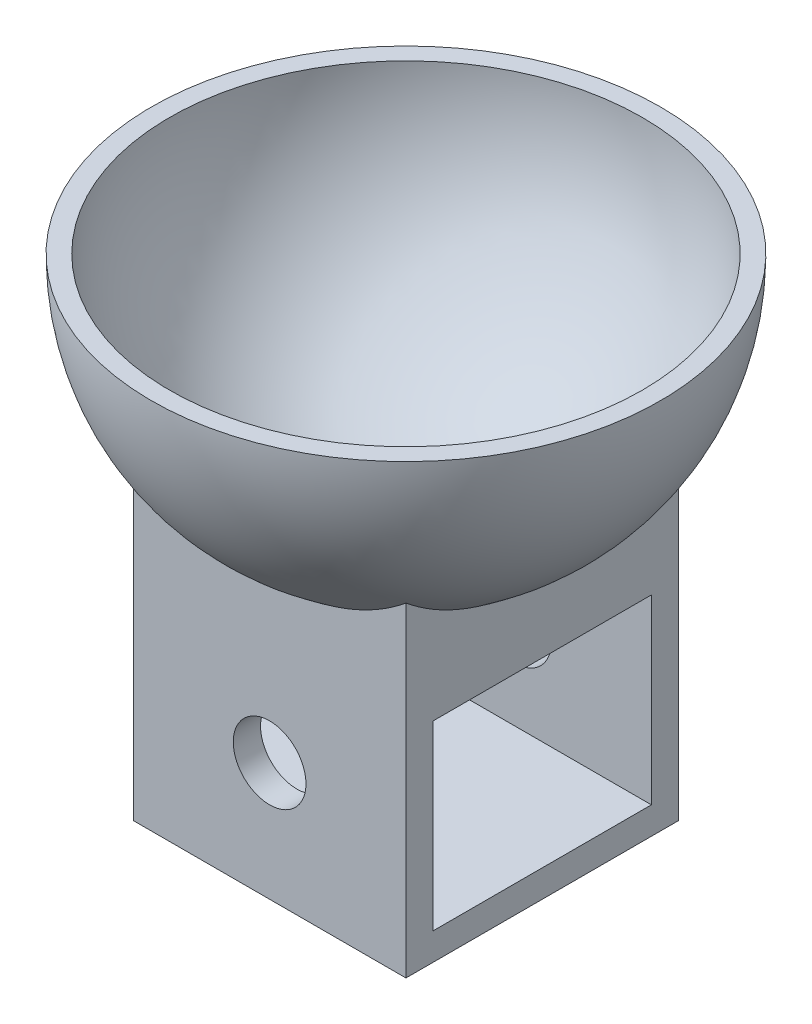
ISO-10303-21;
HEADER;
FILE_DESCRIPTION(('STEP AP214'),'2;1');
FILE_NAME('part.step','',(''),(''),'','','');
FILE_SCHEMA(('AUTOMOTIVE_DESIGN { 1 0 10303 214 1 1 1 1 }'));
ENDSEC;
DATA;
#1=APPLICATION_CONTEXT('core data for automotive mechanical design processes');
#2=APPLICATION_PROTOCOL_DEFINITION('international standard','automotive_design',2000,#1);
#3=PRODUCT_CONTEXT('',#1,'mechanical');
#4=PRODUCT('Part','Part','',(#3));
#5=PRODUCT_RELATED_PRODUCT_CATEGORY('part','',(#4));
#6=PRODUCT_DEFINITION_FORMATION('','',#4);
#7=PRODUCT_DEFINITION_CONTEXT('part definition',#1,'design');
#8=PRODUCT_DEFINITION('design','',#6,#7);
#9=PRODUCT_DEFINITION_SHAPE('','',#8);
#10=(LENGTH_UNIT() NAMED_UNIT(*) SI_UNIT(.MILLI.,.METRE.));
#11=(NAMED_UNIT(*) PLANE_ANGLE_UNIT() SI_UNIT($,.RADIAN.));
#12=(NAMED_UNIT(*) SI_UNIT($,.STERADIAN.) SOLID_ANGLE_UNIT());
#13=UNCERTAINTY_MEASURE_WITH_UNIT(LENGTH_MEASURE(1.E-05),#10,'distance_accuracy_value','');
#14=(GEOMETRIC_REPRESENTATION_CONTEXT(3) GLOBAL_UNCERTAINTY_ASSIGNED_CONTEXT((#13)) GLOBAL_UNIT_ASSIGNED_CONTEXT((#10,
#11,#12)) REPRESENTATION_CONTEXT('',''));
#15=CARTESIAN_POINT('',(0.,0.,0.));
#16=DIRECTION('',(0.,0.,1.));
#17=DIRECTION('',(1.,0.,0.));
#18=AXIS2_PLACEMENT_3D('',#15,#16,#17);
#19=CARTESIAN_POINT('',(15.,26.,15.));
#20=DIRECTION('',(-1.,0.,0.));
#21=DIRECTION('',(0.,0.,1.));
#22=AXIS2_PLACEMENT_3D('',#19,#20,#21);
#23=PLANE('',#22);
#24=DIRECTION('',(0.,0.,-1.));
#25=VECTOR('',#24,1.);
#26=CARTESIAN_POINT('',(15.,0.,15.));
#27=LINE('',#26,#25);
#28=CARTESIAN_POINT('',(15.,0.,15.));
#29=VERTEX_POINT('',#28);
#30=CARTESIAN_POINT('',(15.,0.,-15.));
#31=VERTEX_POINT('',#30);
#32=EDGE_CURVE('E159',#29,#31,#27,.T.);
#33=ORIENTED_EDGE('',*,*,#32,.T.);
#34=DIRECTION('',(0.,-1.,0.));
#35=VECTOR('',#34,1.);
#36=CARTESIAN_POINT('',(15.,26.,-15.));
#37=LINE('',#36,#35);
#38=CARTESIAN_POINT('',(15.,35.7243331175029,-15.));
#39=VERTEX_POINT('',#38);
#40=EDGE_CURVE('E11',#39,#31,#37,.T.);
#41=ORIENTED_EDGE('',*,*,#40,.F.);
#42=CARTESIAN_POINT('',(15.,54.,0.));
#43=DIRECTION('',(-1.,0.,0.));
#44=DIRECTION('',(0.,0.,1.));
#45=AXIS2_PLACEMENT_3D('',#42,#43,#44);
#46=CIRCLE('',#45,23.6431808350738);
#47=CARTESIAN_POINT('',(15.,35.7243331175029,15.));
#48=VERTEX_POINT('',#47);
#49=EDGE_CURVE('E98',#48,#39,#46,.F.);
#50=ORIENTED_EDGE('',*,*,#49,.F.);
#51=DIRECTION('',(0.,-1.,0.));
#52=VECTOR('',#51,1.);
#53=CARTESIAN_POINT('',(15.,26.,15.));
#54=LINE('',#53,#52);
#55=EDGE_CURVE('E102',#48,#29,#54,.T.);
#56=ORIENTED_EDGE('',*,*,#55,.T.);
#57=EDGE_LOOP('',(#33,#41,#50,#56));
#58=FACE_BOUND('',#57,.T.);
#59=DIRECTION('',(0.,0.,-1.));
#60=VECTOR('',#59,1.);
#61=CARTESIAN_POINT('',(15.,3.,0.));
#62=LINE('',#61,#60);
#63=CARTESIAN_POINT('',(15.,3.,12.));
#64=VERTEX_POINT('',#63);
#65=CARTESIAN_POINT('',(15.,3.,-12.));
#66=VERTEX_POINT('',#65);
#67=EDGE_CURVE('E137',#64,#66,#62,.T.);
#68=ORIENTED_EDGE('',*,*,#67,.F.);
#69=DIRECTION('',(0.,-1.,0.));
#70=VECTOR('',#69,1.);
#71=CARTESIAN_POINT('',(15.,26.,12.));
#72=LINE('',#71,#70);
#73=CARTESIAN_POINT('',(15.,23.,12.));
#74=VERTEX_POINT('',#73);
#75=EDGE_CURVE('E145',#74,#64,#72,.T.);
#76=ORIENTED_EDGE('',*,*,#75,.F.);
#77=DIRECTION('',(0.,0.,-1.));
#78=VECTOR('',#77,1.);
#79=CARTESIAN_POINT('',(15.,23.,0.));
#80=LINE('',#79,#78);
#81=CARTESIAN_POINT('',(15.,23.,-12.));
#82=VERTEX_POINT('',#81);
#83=EDGE_CURVE('E48',#74,#82,#80,.T.);
#84=ORIENTED_EDGE('',*,*,#83,.T.);
#85=DIRECTION('',(0.,-1.,0.));
#86=VECTOR('',#85,1.);
#87=CARTESIAN_POINT('',(15.,26.,-12.));
#88=LINE('',#87,#86);
#89=EDGE_CURVE('E151',#82,#66,#88,.T.);
#90=ORIENTED_EDGE('',*,*,#89,.T.);
#91=EDGE_LOOP('',(#68,#76,#84,#90));
#92=FACE_BOUND('',#91,.T.);
#93=ADVANCED_FACE('F33',(#58,#92),#23,.F.);
#94=CARTESIAN_POINT('',(-15.,26.,15.));
#95=DIRECTION('',(1.,0.,0.));
#96=DIRECTION('',(0.,0.,-1.));
#97=AXIS2_PLACEMENT_3D('',#94,#95,#96);
#98=PLANE('',#97);
#99=DIRECTION('',(0.,0.,1.));
#100=VECTOR('',#99,1.);
#101=CARTESIAN_POINT('',(-15.,0.,15.));
#102=LINE('',#101,#100);
#103=CARTESIAN_POINT('',(-15.,0.,-15.));
#104=VERTEX_POINT('',#103);
#105=CARTESIAN_POINT('',(-15.,0.,15.));
#106=VERTEX_POINT('',#105);
#107=EDGE_CURVE('E168',#104,#106,#102,.T.);
#108=ORIENTED_EDGE('',*,*,#107,.T.);
#109=DIRECTION('',(0.,-1.,0.));
#110=VECTOR('',#109,1.);
#111=CARTESIAN_POINT('',(-15.,26.,15.));
#112=LINE('',#111,#110);
#113=CARTESIAN_POINT('',(-15.,35.7243331175029,15.));
#114=VERTEX_POINT('',#113);
#115=EDGE_CURVE('E118',#114,#106,#112,.T.);
#116=ORIENTED_EDGE('',*,*,#115,.F.);
#117=CARTESIAN_POINT('',(-15.,54.,0.));
#118=DIRECTION('',(1.,0.,0.));
#119=DIRECTION('',(0.,0.,-1.));
#120=AXIS2_PLACEMENT_3D('',#117,#118,#119);
#121=CIRCLE('',#120,23.6431808350738);
#122=CARTESIAN_POINT('',(-15.,35.7243331175029,-15.));
#123=VERTEX_POINT('',#122);
#124=EDGE_CURVE('E122',#123,#114,#121,.F.);
#125=ORIENTED_EDGE('',*,*,#124,.F.);
#126=DIRECTION('',(0.,-1.,0.));
#127=VECTOR('',#126,1.);
#128=CARTESIAN_POINT('',(-15.,26.,-15.));
#129=LINE('',#128,#127);
#130=EDGE_CURVE('E41',#123,#104,#129,.T.);
#131=ORIENTED_EDGE('',*,*,#130,.T.);
#132=EDGE_LOOP('',(#108,#116,#125,#131));
#133=FACE_BOUND('',#132,.T.);
#134=DIRECTION('',(0.,0.,1.));
#135=VECTOR('',#134,1.);
#136=CARTESIAN_POINT('',(-15.,3.,0.));
#137=LINE('',#136,#135);
#138=CARTESIAN_POINT('',(-15.,3.,-12.));
#139=VERTEX_POINT('',#138);
#140=CARTESIAN_POINT('',(-15.,3.,12.));
#141=VERTEX_POINT('',#140);
#142=EDGE_CURVE('E140',#139,#141,#137,.T.);
#143=ORIENTED_EDGE('',*,*,#142,.F.);
#144=DIRECTION('',(0.,-1.,0.));
#145=VECTOR('',#144,1.);
#146=CARTESIAN_POINT('',(-15.,26.,-12.));
#147=LINE('',#146,#145);
#148=CARTESIAN_POINT('',(-15.,23.,-12.));
#149=VERTEX_POINT('',#148);
#150=EDGE_CURVE('E148',#149,#139,#147,.T.);
#151=ORIENTED_EDGE('',*,*,#150,.F.);
#152=DIRECTION('',(0.,0.,1.));
#153=VECTOR('',#152,1.);
#154=CARTESIAN_POINT('',(-15.,23.,0.));
#155=LINE('',#154,#153);
#156=CARTESIAN_POINT('',(-15.,23.,12.));
#157=VERTEX_POINT('',#156);
#158=EDGE_CURVE('E53',#149,#157,#155,.T.);
#159=ORIENTED_EDGE('',*,*,#158,.T.);
#160=DIRECTION('',(0.,-1.,0.));
#161=VECTOR('',#160,1.);
#162=CARTESIAN_POINT('',(-15.,26.,12.));
#163=LINE('',#162,#161);
#164=EDGE_CURVE('E152',#157,#141,#163,.T.);
#165=ORIENTED_EDGE('',*,*,#164,.T.);
#166=EDGE_LOOP('',(#143,#151,#159,#165));
#167=FACE_BOUND('',#166,.T.);
#168=ADVANCED_FACE('F175',(#133,#167),#98,.F.);
#169=CARTESIAN_POINT('',(-15.,26.,-15.));
#170=DIRECTION('',(0.,0.,1.));
#171=DIRECTION('',(1.,0.,0.));
#172=AXIS2_PLACEMENT_3D('',#169,#170,#171);
#173=PLANE('',#172);
#174=CARTESIAN_POINT('',(0.,13.,-15.));
#175=DIRECTION('',(0.,0.,1.));
#176=DIRECTION('',(1.,0.,0.));
#177=AXIS2_PLACEMENT_3D('',#174,#175,#176);
#178=CIRCLE('',#177,4.);
#179=CARTESIAN_POINT('',(4.,13.,-15.));
#180=VERTEX_POINT('',#179);
#181=EDGE_CURVE('E128',#180,#180,#178,.T.);
#182=ORIENTED_EDGE('',*,*,#181,.T.);
#183=EDGE_LOOP('',(#182));
#184=FACE_BOUND('',#183,.T.);
#185=DIRECTION('',(-1.,0.,0.));
#186=VECTOR('',#185,1.);
#187=CARTESIAN_POINT('',(-15.,0.,-15.));
#188=LINE('',#187,#186);
#189=EDGE_CURVE('E166',#31,#104,#188,.T.);
#190=ORIENTED_EDGE('',*,*,#189,.T.);
#191=ORIENTED_EDGE('',*,*,#130,.F.);
#192=CARTESIAN_POINT('',(0.,54.,-15.));
#193=DIRECTION('',(0.,0.,1.));
#194=DIRECTION('',(1.,0.,0.));
#195=AXIS2_PLACEMENT_3D('',#192,#193,#194);
#196=CIRCLE('',#195,23.6431808350738);
#197=EDGE_CURVE('E124',#39,#123,#196,.F.);
#198=ORIENTED_EDGE('',*,*,#197,.F.);
#199=ORIENTED_EDGE('',*,*,#40,.T.);
#200=EDGE_LOOP('',(#190,#191,#198,#199));
#201=FACE_BOUND('',#200,.T.);
#202=ADVANCED_FACE('F180',(#184,#201),#173,.F.);
#203=CARTESIAN_POINT('',(-15.,26.,15.));
#204=DIRECTION('',(0.,0.,-1.));
#205=DIRECTION('',(-1.,0.,0.));
#206=AXIS2_PLACEMENT_3D('',#203,#204,#205);
#207=PLANE('',#206);
#208=CARTESIAN_POINT('',(0.,13.,15.));
#209=DIRECTION('',(0.,0.,1.));
#210=DIRECTION('',(1.,0.,0.));
#211=AXIS2_PLACEMENT_3D('',#208,#209,#210);
#212=CIRCLE('',#211,4.);
#213=CARTESIAN_POINT('',(4.,13.,15.));
#214=VERTEX_POINT('',#213);
#215=EDGE_CURVE('E131',#214,#214,#212,.T.);
#216=ORIENTED_EDGE('',*,*,#215,.F.);
#217=EDGE_LOOP('',(#216));
#218=FACE_BOUND('',#217,.T.);
#219=DIRECTION('',(1.,0.,0.));
#220=VECTOR('',#219,1.);
#221=CARTESIAN_POINT('',(-15.,0.,15.));
#222=LINE('',#221,#220);
#223=EDGE_CURVE('E117',#106,#29,#222,.T.);
#224=ORIENTED_EDGE('',*,*,#223,.T.);
#225=ORIENTED_EDGE('',*,*,#55,.F.);
#226=CARTESIAN_POINT('',(0.,54.,15.));
#227=DIRECTION('',(0.,0.,-1.));
#228=DIRECTION('',(-1.,0.,0.));
#229=AXIS2_PLACEMENT_3D('',#226,#227,#228);
#230=CIRCLE('',#229,23.6431808350738);
#231=EDGE_CURVE('E108',#114,#48,#230,.F.);
#232=ORIENTED_EDGE('',*,*,#231,.F.);
#233=ORIENTED_EDGE('',*,*,#115,.T.);
#234=EDGE_LOOP('',(#224,#225,#232,#233));
#235=FACE_BOUND('',#234,.T.);
#236=ADVANCED_FACE('F113',(#218,#235),#207,.F.);
#237=CARTESIAN_POINT('',(0.,0.,0.));
#238=DIRECTION('',(0.,-1.,0.));
#239=DIRECTION('',(0.,0.,-1.));
#240=AXIS2_PLACEMENT_3D('',#237,#238,#239);
#241=PLANE('',#240);
#242=ORIENTED_EDGE('',*,*,#32,.F.);
#243=ORIENTED_EDGE('',*,*,#223,.F.);
#244=ORIENTED_EDGE('',*,*,#107,.F.);
#245=ORIENTED_EDGE('',*,*,#189,.F.);
#246=EDGE_LOOP('',(#242,#243,#244,#245));
#247=FACE_BOUND('',#246,.T.);
#248=ADVANCED_FACE('F179',(#247),#241,.T.);
#249=CARTESIAN_POINT('',(-15.,26.,-12.));
#250=DIRECTION('',(0.,0.,1.));
#251=DIRECTION('',(1.,0.,0.));
#252=AXIS2_PLACEMENT_3D('',#249,#250,#251);
#253=PLANE('',#252);
#254=CARTESIAN_POINT('',(0.,13.,-12.));
#255=DIRECTION('',(0.,0.,1.));
#256=DIRECTION('',(1.,0.,0.));
#257=AXIS2_PLACEMENT_3D('',#254,#255,#256);
#258=CIRCLE('',#257,4.);
#259=CARTESIAN_POINT('',(4.,13.,-12.));
#260=VERTEX_POINT('',#259);
#261=EDGE_CURVE('E134',#260,#260,#258,.T.);
#262=ORIENTED_EDGE('',*,*,#261,.F.);
#263=EDGE_LOOP('',(#262));
#264=FACE_BOUND('',#263,.T.);
#265=DIRECTION('',(-1.,0.,0.));
#266=VECTOR('',#265,1.);
#267=CARTESIAN_POINT('',(0.,3.,-12.));
#268=LINE('',#267,#266);
#269=EDGE_CURVE('E138',#66,#139,#268,.T.);
#270=ORIENTED_EDGE('',*,*,#269,.F.);
#271=ORIENTED_EDGE('',*,*,#89,.F.);
#272=DIRECTION('',(-1.,0.,0.));
#273=VECTOR('',#272,1.);
#274=CARTESIAN_POINT('',(0.,23.,-12.));
#275=LINE('',#274,#273);
#276=EDGE_CURVE('E141',#82,#149,#275,.T.);
#277=ORIENTED_EDGE('',*,*,#276,.T.);
#278=ORIENTED_EDGE('',*,*,#150,.T.);
#279=EDGE_LOOP('',(#270,#271,#277,#278));
#280=FACE_BOUND('',#279,.T.);
#281=ADVANCED_FACE('F213',(#264,#280),#253,.T.);
#282=CARTESIAN_POINT('',(-15.,26.,12.));
#283=DIRECTION('',(0.,0.,-1.));
#284=DIRECTION('',(-1.,0.,0.));
#285=AXIS2_PLACEMENT_3D('',#282,#283,#284);
#286=PLANE('',#285);
#287=CARTESIAN_POINT('',(0.,13.,12.));
#288=DIRECTION('',(0.,0.,-1.));
#289=DIRECTION('',(-1.,0.,0.));
#290=AXIS2_PLACEMENT_3D('',#287,#288,#289);
#291=CIRCLE('',#290,4.);
#292=CARTESIAN_POINT('',(-4.,13.,12.));
#293=VERTEX_POINT('',#292);
#294=EDGE_CURVE('E36',#293,#293,#291,.T.);
#295=ORIENTED_EDGE('',*,*,#294,.F.);
#296=EDGE_LOOP('',(#295));
#297=FACE_BOUND('',#296,.T.);
#298=DIRECTION('',(1.,0.,0.));
#299=VECTOR('',#298,1.);
#300=CARTESIAN_POINT('',(0.,3.,12.));
#301=LINE('',#300,#299);
#302=EDGE_CURVE('E146',#141,#64,#301,.T.);
#303=ORIENTED_EDGE('',*,*,#302,.F.);
#304=ORIENTED_EDGE('',*,*,#164,.F.);
#305=DIRECTION('',(1.,0.,0.));
#306=VECTOR('',#305,1.);
#307=CARTESIAN_POINT('',(0.,23.,12.));
#308=LINE('',#307,#306);
#309=EDGE_CURVE('E143',#157,#74,#308,.T.);
#310=ORIENTED_EDGE('',*,*,#309,.T.);
#311=ORIENTED_EDGE('',*,*,#75,.T.);
#312=EDGE_LOOP('',(#303,#304,#310,#311));
#313=FACE_BOUND('',#312,.T.);
#314=ADVANCED_FACE('F222',(#297,#313),#286,.T.);
#315=CARTESIAN_POINT('',(0.,23.,0.));
#316=DIRECTION('',(0.,-1.,0.));
#317=DIRECTION('',(0.,0.,-1.));
#318=AXIS2_PLACEMENT_3D('',#315,#316,#317);
#319=PLANE('',#318);
#320=ORIENTED_EDGE('',*,*,#83,.F.);
#321=ORIENTED_EDGE('',*,*,#309,.F.);
#322=ORIENTED_EDGE('',*,*,#158,.F.);
#323=ORIENTED_EDGE('',*,*,#276,.F.);
#324=EDGE_LOOP('',(#320,#321,#322,#323));
#325=FACE_BOUND('',#324,.T.);
#326=ADVANCED_FACE('F218',(#325),#319,.T.);
#327=CARTESIAN_POINT('',(0.,3.,0.));
#328=DIRECTION('',(0.,-1.,0.));
#329=DIRECTION('',(0.,0.,-1.));
#330=AXIS2_PLACEMENT_3D('',#327,#328,#329);
#331=PLANE('',#330);
#332=ORIENTED_EDGE('',*,*,#67,.T.);
#333=ORIENTED_EDGE('',*,*,#269,.T.);
#334=ORIENTED_EDGE('',*,*,#142,.T.);
#335=ORIENTED_EDGE('',*,*,#302,.T.);
#336=EDGE_LOOP('',(#332,#333,#334,#335));
#337=FACE_BOUND('',#336,.T.);
#338=ADVANCED_FACE('F214',(#337),#331,.F.);
#339=CARTESIAN_POINT('',(0.,13.,-15.));
#340=DIRECTION('',(0.,0.,1.));
#341=DIRECTION('',(1.,0.,0.));
#342=AXIS2_PLACEMENT_3D('',#339,#340,#341);
#343=CYLINDRICAL_SURFACE('',#342,4.);
#344=ORIENTED_EDGE('',*,*,#294,.T.);
#345=EDGE_LOOP('',(#344));
#346=FACE_BOUND('',#345,.T.);
#347=ORIENTED_EDGE('',*,*,#215,.T.);
#348=EDGE_LOOP('',(#347));
#349=FACE_BOUND('',#348,.T.);
#350=ADVANCED_FACE('F217',(#346,#349),#343,.F.);
#351=ORIENTED_EDGE('',*,*,#261,.T.);
#352=EDGE_LOOP('',(#351));
#353=FACE_BOUND('',#352,.T.);
#354=ORIENTED_EDGE('',*,*,#181,.F.);
#355=EDGE_LOOP('',(#354));
#356=FACE_BOUND('',#355,.T.);
#357=ADVANCED_FACE('F231',(#353,#356),#343,.F.);
#358=CARTESIAN_POINT('',(0.,54.,0.));
#359=DIRECTION('',(0.,-1.,0.));
#360=DIRECTION('',(-1.,0.,0.));
#361=AXIS2_PLACEMENT_3D('',#358,#359,#360);
#362=SPHERICAL_SURFACE('',#361,28.);
#363=CARTESIAN_POINT('',(0.,54.,0.));
#364=DIRECTION('',(0.,-1.,0.));
#365=DIRECTION('',(0.,0.,-1.));
#366=AXIS2_PLACEMENT_3D('',#363,#364,#365);
#367=CIRCLE('',#366,28.);
#368=CARTESIAN_POINT('',(0.,54.,-28.));
#369=VERTEX_POINT('',#368);
#370=EDGE_CURVE('E109',#369,#369,#367,.T.);
#371=ORIENTED_EDGE('',*,*,#370,.T.);
#372=EDGE_LOOP('',(#371));
#373=FACE_BOUND('',#372,.T.);
#374=ORIENTED_EDGE('',*,*,#49,.T.);
#375=ORIENTED_EDGE('',*,*,#197,.T.);
#376=ORIENTED_EDGE('',*,*,#124,.T.);
#377=ORIENTED_EDGE('',*,*,#231,.T.);
#378=EDGE_LOOP('',(#374,#375,#376,#377));
#379=FACE_BOUND('',#378,.T.);
#380=ADVANCED_FACE('F120',(#373,#379),#362,.T.);
#381=CARTESIAN_POINT('',(-28.,54.,0.));
#382=DIRECTION('',(0.,-1.,0.));
#383=DIRECTION('',(0.,0.,-1.));
#384=AXIS2_PLACEMENT_3D('',#381,#382,#383);
#385=PLANE('',#384);
#386=ORIENTED_EDGE('',*,*,#370,.F.);
#387=EDGE_LOOP('',(#386));
#388=FACE_BOUND('',#387,.T.);
#389=CARTESIAN_POINT('',(0.,54.,0.));
#390=DIRECTION('',(0.,-1.,0.));
#391=DIRECTION('',(0.,0.,-1.));
#392=AXIS2_PLACEMENT_3D('',#389,#390,#391);
#393=CIRCLE('',#392,26.);
#394=CARTESIAN_POINT('',(0.,54.,-26.));
#395=VERTEX_POINT('',#394);
#396=EDGE_CURVE('E184',#395,#395,#393,.T.);
#397=ORIENTED_EDGE('',*,*,#396,.T.);
#398=EDGE_LOOP('',(#397));
#399=FACE_BOUND('',#398,.T.);
#400=ADVANCED_FACE('F188',(#388,#399),#385,.F.);
#401=CARTESIAN_POINT('',(0.,54.,0.));
#402=DIRECTION('',(0.,-1.,0.));
#403=DIRECTION('',(1.,0.,0.));
#404=AXIS2_PLACEMENT_3D('',#401,#402,#403);
#405=SPHERICAL_SURFACE('',#404,26.);
#406=ORIENTED_EDGE('',*,*,#396,.F.);
#407=EDGE_LOOP('',(#406));
#408=FACE_BOUND('',#407,.T.);
#409=ADVANCED_FACE('F190',(#408),#405,.F.);
#410=CLOSED_SHELL('',(#93,#168,#202,#236,#248,#281,#314,#326,#338,#350,#357,#380,#400,#409));
#411=MANIFOLD_SOLID_BREP('B2',#410);
#412=ADVANCED_BREP_SHAPE_REPRESENTATION('',(#18,#411),#14);
#413=SHAPE_DEFINITION_REPRESENTATION(#9,#412);
ENDSEC;
END-ISO-10303-21;
